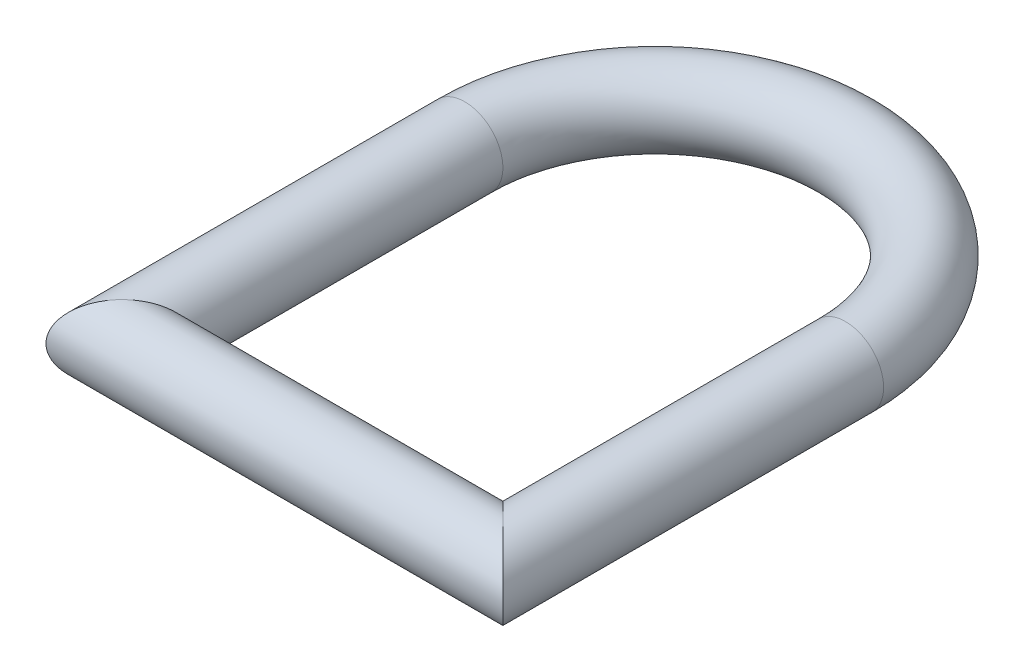
ISO-10303-21;
HEADER;
FILE_DESCRIPTION(('STEP AP214'),'2;1');
FILE_NAME('part.step','',(''),(''),'','','');
FILE_SCHEMA(('AUTOMOTIVE_DESIGN { 1 0 10303 214 1 1 1 1 }'));
ENDSEC;
DATA;
#1=APPLICATION_CONTEXT('core data for automotive mechanical design processes');
#2=APPLICATION_PROTOCOL_DEFINITION('international standard','automotive_design',2000,#1);
#3=PRODUCT_CONTEXT('',#1,'mechanical');
#4=PRODUCT('Part','Part','',(#3));
#5=PRODUCT_RELATED_PRODUCT_CATEGORY('part','',(#4));
#6=PRODUCT_DEFINITION_FORMATION('','',#4);
#7=PRODUCT_DEFINITION_CONTEXT('part definition',#1,'design');
#8=PRODUCT_DEFINITION('design','',#6,#7);
#9=PRODUCT_DEFINITION_SHAPE('','',#8);
#10=(LENGTH_UNIT() NAMED_UNIT(*) SI_UNIT(.MILLI.,.METRE.));
#11=(NAMED_UNIT(*) PLANE_ANGLE_UNIT() SI_UNIT($,.RADIAN.));
#12=(NAMED_UNIT(*) SI_UNIT($,.STERADIAN.) SOLID_ANGLE_UNIT());
#13=UNCERTAINTY_MEASURE_WITH_UNIT(LENGTH_MEASURE(1.E-05),#10,'distance_accuracy_value','');
#14=(GEOMETRIC_REPRESENTATION_CONTEXT(3) GLOBAL_UNCERTAINTY_ASSIGNED_CONTEXT((#13)) GLOBAL_UNIT_ASSIGNED_CONTEXT((#10,
#11,#12)) REPRESENTATION_CONTEXT('',''));
#15=CARTESIAN_POINT('',(0.,0.,0.));
#16=DIRECTION('',(0.,0.,1.));
#17=DIRECTION('',(1.,0.,0.));
#18=AXIS2_PLACEMENT_3D('',#15,#16,#17);
#19=CARTESIAN_POINT('',(250.,0.,350.));
#20=DIRECTION('',(0.,0.,-1.));
#21=DIRECTION('',(-1.,0.,0.));
#22=AXIS2_PLACEMENT_3D('',#19,#20,#21);
#23=CYLINDRICAL_SURFACE('',#22,50.);
#24=CARTESIAN_POINT('',(250.,0.,0.));
#25=DIRECTION('',(0.,0.,-1.));
#26=DIRECTION('',(-1.,0.,0.));
#27=AXIS2_PLACEMENT_3D('',#24,#25,#26);
#28=CIRCLE('',#27,50.);
#29=CARTESIAN_POINT('',(300.,0.,0.));
#30=VERTEX_POINT('',#29);
#31=EDGE_CURVE('E10',#30,#30,#28,.F.);
#32=ORIENTED_EDGE('',*,*,#31,.T.);
#33=EDGE_LOOP('',(#32));
#34=FACE_BOUND('',#33,.T.);
#35=CARTESIAN_POINT('',(250.,0.,450.));
#36=DIRECTION('',(-0.707106781186548,0.,0.707106781186547));
#37=DIRECTION('',(0.707106781186547,0.,0.707106781186548));
#38=AXIS2_PLACEMENT_3D('',#35,#36,#37);
#39=ELLIPSE('',#38,70.7106781186548,50.0000000000001);
#40=CARTESIAN_POINT('',(300.,0.,500.));
#41=VERTEX_POINT('',#40);
#42=EDGE_CURVE('E66',#41,#41,#39,.F.);
#43=ORIENTED_EDGE('',*,*,#42,.T.);
#44=EDGE_LOOP('',(#43));
#45=FACE_BOUND('',#44,.T.);
#46=ADVANCED_FACE('F38',(#34,#45),#23,.T.);
#47=CARTESIAN_POINT('',(305.1,0.,450.));
#48=DIRECTION('',(-1.,0.,0.));
#49=DIRECTION('',(0.,0.,1.));
#50=AXIS2_PLACEMENT_3D('',#47,#48,#49);
#51=CYLINDRICAL_SURFACE('',#50,50.0000000000001);
#52=ORIENTED_EDGE('',*,*,#42,.F.);
#53=EDGE_LOOP('',(#52));
#54=FACE_BOUND('',#53,.T.);
#55=CARTESIAN_POINT('',(-250.,0.,450.));
#56=DIRECTION('',(0.707106781186548,0.,0.707106781186547));
#57=DIRECTION('',(-0.707106781186547,0.,0.707106781186548));
#58=AXIS2_PLACEMENT_3D('',#55,#56,#57);
#59=ELLIPSE('',#58,70.7106781186548,50.0000000000001);
#60=CARTESIAN_POINT('',(-300.,0.,500.));
#61=VERTEX_POINT('',#60);
#62=EDGE_CURVE('E74',#61,#61,#59,.F.);
#63=ORIENTED_EDGE('',*,*,#62,.F.);
#64=EDGE_LOOP('',(#63));
#65=FACE_BOUND('',#64,.T.);
#66=ADVANCED_FACE('F108',(#54,#65),#51,.T.);
#67=CARTESIAN_POINT('',(0.,0.,0.));
#68=DIRECTION('',(0.,-1.,0.));
#69=DIRECTION('',(0.,0.,-1.));
#70=AXIS2_PLACEMENT_3D('',#67,#68,#69);
#71=TOROIDAL_SURFACE('',#70,250.,50.);
#72=CARTESIAN_POINT('',(-250.,0.,0.));
#73=DIRECTION('',(0.,0.,-1.));
#74=DIRECTION('',(-1.,0.,0.));
#75=AXIS2_PLACEMENT_3D('',#72,#73,#74);
#76=CIRCLE('',#75,50.);
#77=CARTESIAN_POINT('',(-300.,0.,0.));
#78=VERTEX_POINT('',#77);
#79=EDGE_CURVE('E48',#78,#78,#76,.F.);
#80=CARTESIAN_POINT('',(0.,0.,0.));
#81=DIRECTION('',(0.,-1.,0.));
#82=DIRECTION('',(0.,0.,-1.));
#83=AXIS2_PLACEMENT_3D('',#80,#81,#82);
#84=CIRCLE('',#83,300.);
#85=EDGE_CURVE('',#78,#30,#84,.T.);
#86=ORIENTED_EDGE('',*,*,#79,.F.);
#87=ORIENTED_EDGE('',*,*,#31,.F.);
#88=ORIENTED_EDGE('',*,*,#85,.T.);
#89=ORIENTED_EDGE('',*,*,#85,.F.);
#90=EDGE_LOOP('',(#86,#88,#87,#89));
#91=FACE_BOUND('',#90,.T.);
#92=ADVANCED_FACE('F40',(#91),#71,.T.);
#93=CARTESIAN_POINT('',(-250.,0.,350.));
#94=DIRECTION('',(0.,0.,-1.));
#95=DIRECTION('',(-1.,0.,0.));
#96=AXIS2_PLACEMENT_3D('',#93,#94,#95);
#97=CYLINDRICAL_SURFACE('',#96,50.);
#98=ORIENTED_EDGE('',*,*,#79,.T.);
#99=EDGE_LOOP('',(#98));
#100=FACE_BOUND('',#99,.T.);
#101=ORIENTED_EDGE('',*,*,#62,.T.);
#102=EDGE_LOOP('',(#101));
#103=FACE_BOUND('',#102,.T.);
#104=ADVANCED_FACE('F110',(#100,#103),#97,.T.);
#105=CLOSED_SHELL('',(#46,#66,#92,#104));
#106=CARTESIAN_POINT('',(0.,0.,0.));
#107=DIRECTION('',(0.,-1.,0.));
#108=DIRECTION('',(0.,0.,-1.));
#109=AXIS2_PLACEMENT_3D('',#106,#107,#108);
#110=TOROIDAL_SURFACE('',#109,250.,47.5);
#111=CARTESIAN_POINT('',(-250.,0.,0.));
#112=DIRECTION('',(0.,0.,-1.));
#113=DIRECTION('',(-1.,0.,0.));
#114=AXIS2_PLACEMENT_3D('',#111,#112,#113);
#115=CIRCLE('',#114,47.5);
#116=CARTESIAN_POINT('',(-297.5,0.,0.));
#117=VERTEX_POINT('',#116);
#118=EDGE_CURVE('E56',#117,#117,#115,.F.);
#119=CARTESIAN_POINT('',(250.,0.,0.));
#120=DIRECTION('',(0.,0.,-1.));
#121=DIRECTION('',(-1.,0.,0.));
#122=AXIS2_PLACEMENT_3D('',#119,#120,#121);
#123=CIRCLE('',#122,47.5);
#124=CARTESIAN_POINT('',(297.5,0.,0.));
#125=VERTEX_POINT('',#124);
#126=EDGE_CURVE('E42',#125,#125,#123,.F.);
#127=CARTESIAN_POINT('',(0.,0.,0.));
#128=DIRECTION('',(0.,-1.,0.));
#129=DIRECTION('',(0.,0.,-1.));
#130=AXIS2_PLACEMENT_3D('',#127,#128,#129);
#131=CIRCLE('',#130,297.5);
#132=EDGE_CURVE('',#117,#125,#131,.T.);
#133=ORIENTED_EDGE('',*,*,#118,.T.);
#134=ORIENTED_EDGE('',*,*,#126,.T.);
#135=ORIENTED_EDGE('',*,*,#132,.T.);
#136=ORIENTED_EDGE('',*,*,#132,.F.);
#137=EDGE_LOOP('',(#133,#135,#134,#136));
#138=FACE_BOUND('',#137,.T.);
#139=ADVANCED_FACE('F95',(#138),#110,.F.);
#140=CARTESIAN_POINT('',(250.,0.,350.));
#141=DIRECTION('',(0.,0.,-1.));
#142=DIRECTION('',(-1.,0.,0.));
#143=AXIS2_PLACEMENT_3D('',#140,#141,#142);
#144=CYLINDRICAL_SURFACE('',#143,47.5);
#145=ORIENTED_EDGE('',*,*,#126,.F.);
#146=EDGE_LOOP('',(#145));
#147=FACE_BOUND('',#146,.T.);
#148=CARTESIAN_POINT('',(250.,0.,450.));
#149=DIRECTION('',(-0.707106781186548,0.,0.707106781186547));
#150=DIRECTION('',(0.707106781186547,0.,0.707106781186548));
#151=AXIS2_PLACEMENT_3D('',#148,#149,#150);
#152=ELLIPSE('',#151,67.175144212722,47.5);
#153=CARTESIAN_POINT('',(297.5,0.,497.5));
#154=VERTEX_POINT('',#153);
#155=EDGE_CURVE('E59',#154,#154,#152,.T.);
#156=ORIENTED_EDGE('',*,*,#155,.T.);
#157=EDGE_LOOP('',(#156));
#158=FACE_BOUND('',#157,.T.);
#159=ADVANCED_FACE('F92',(#147,#158),#144,.F.);
#160=CARTESIAN_POINT('',(-250.,0.,350.));
#161=DIRECTION('',(0.,0.,-1.));
#162=DIRECTION('',(-1.,0.,0.));
#163=AXIS2_PLACEMENT_3D('',#160,#161,#162);
#164=CYLINDRICAL_SURFACE('',#163,47.5);
#165=ORIENTED_EDGE('',*,*,#118,.F.);
#166=EDGE_LOOP('',(#165));
#167=FACE_BOUND('',#166,.T.);
#168=CARTESIAN_POINT('',(-250.,0.,450.));
#169=DIRECTION('',(0.707106781186548,0.,0.707106781186547));
#170=DIRECTION('',(-0.707106781186547,0.,0.707106781186548));
#171=AXIS2_PLACEMENT_3D('',#168,#169,#170);
#172=ELLIPSE('',#171,67.175144212722,47.5);
#173=CARTESIAN_POINT('',(-297.5,0.,497.5));
#174=VERTEX_POINT('',#173);
#175=EDGE_CURVE('E72',#174,#174,#172,.T.);
#176=ORIENTED_EDGE('',*,*,#175,.T.);
#177=EDGE_LOOP('',(#176));
#178=FACE_BOUND('',#177,.T.);
#179=ADVANCED_FACE('F82',(#167,#178),#164,.F.);
#180=CARTESIAN_POINT('',(302.35,0.,450.));
#181=DIRECTION('',(-1.,0.,0.));
#182=DIRECTION('',(0.,0.,1.));
#183=AXIS2_PLACEMENT_3D('',#180,#181,#182);
#184=CYLINDRICAL_SURFACE('',#183,47.5);
#185=ORIENTED_EDGE('',*,*,#155,.F.);
#186=EDGE_LOOP('',(#185));
#187=FACE_BOUND('',#186,.T.);
#188=ORIENTED_EDGE('',*,*,#175,.F.);
#189=EDGE_LOOP('',(#188));
#190=FACE_BOUND('',#189,.T.);
#191=ADVANCED_FACE('F84',(#187,#190),#184,.F.);
#192=CLOSED_SHELL('',(#139,#159,#179,#191));
#193=ORIENTED_CLOSED_SHELL('',*,#192,.T.);
#194=BREP_WITH_VOIDS('B2',#105,(#193));
#195=ADVANCED_BREP_SHAPE_REPRESENTATION('',(#18,#194),#14);
#196=SHAPE_DEFINITION_REPRESENTATION(#9,#195);
ENDSEC;
END-ISO-10303-21;
